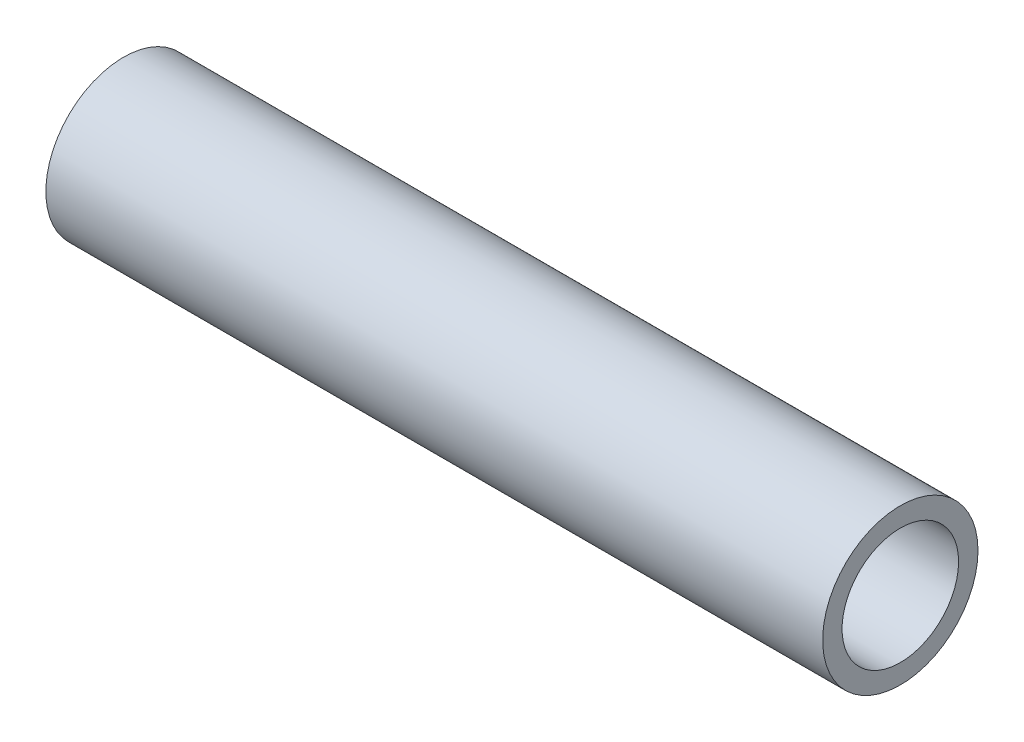
ISO-10303-21;
HEADER;
FILE_DESCRIPTION(('STEP AP214'),'2;1');
FILE_NAME('part.step','',(''),(''),'','','');
FILE_SCHEMA(('AUTOMOTIVE_DESIGN { 1 0 10303 214 1 1 1 1 }'));
ENDSEC;
DATA;
#1=APPLICATION_CONTEXT('core data for automotive mechanical design processes');
#2=APPLICATION_PROTOCOL_DEFINITION('international standard','automotive_design',2000,#1);
#3=PRODUCT_CONTEXT('',#1,'mechanical');
#4=PRODUCT('Part','Part','',(#3));
#5=PRODUCT_RELATED_PRODUCT_CATEGORY('part','',(#4));
#6=PRODUCT_DEFINITION_FORMATION('','',#4);
#7=PRODUCT_DEFINITION_CONTEXT('part definition',#1,'design');
#8=PRODUCT_DEFINITION('design','',#6,#7);
#9=PRODUCT_DEFINITION_SHAPE('','',#8);
#10=(LENGTH_UNIT() NAMED_UNIT(*) SI_UNIT(.MILLI.,.METRE.));
#11=(NAMED_UNIT(*) PLANE_ANGLE_UNIT() SI_UNIT($,.RADIAN.));
#12=(NAMED_UNIT(*) SI_UNIT($,.STERADIAN.) SOLID_ANGLE_UNIT());
#13=UNCERTAINTY_MEASURE_WITH_UNIT(LENGTH_MEASURE(1.E-05),#10,'distance_accuracy_value','');
#14=(GEOMETRIC_REPRESENTATION_CONTEXT(3) GLOBAL_UNCERTAINTY_ASSIGNED_CONTEXT((#13)) GLOBAL_UNIT_ASSIGNED_CONTEXT((#10,
#11,#12)) REPRESENTATION_CONTEXT('',''));
#15=CARTESIAN_POINT('',(0.,0.,0.));
#16=DIRECTION('',(0.,0.,1.));
#17=DIRECTION('',(1.,0.,0.));
#18=AXIS2_PLACEMENT_3D('',#15,#16,#17);
#19=CARTESIAN_POINT('',(0.,0.,0.));
#20=DIRECTION('',(1.,0.,0.));
#21=DIRECTION('',(0.,0.,-1.));
#22=AXIS2_PLACEMENT_3D('',#19,#20,#21);
#23=CYLINDRICAL_SURFACE('',#22,9.525);
#24=CARTESIAN_POINT('',(127.,0.,0.));
#25=DIRECTION('',(1.,0.,0.));
#26=DIRECTION('',(0.,0.,-1.));
#27=AXIS2_PLACEMENT_3D('',#24,#25,#26);
#28=CIRCLE('',#27,9.525);
#29=CARTESIAN_POINT('',(127.,0.,-9.525));
#30=VERTEX_POINT('',#29);
#31=EDGE_CURVE('E26',#30,#30,#28,.F.);
#32=ORIENTED_EDGE('',*,*,#31,.F.);
#33=EDGE_LOOP('',(#32));
#34=FACE_BOUND('',#33,.T.);
#35=CARTESIAN_POINT('',(0.,0.,0.));
#36=DIRECTION('',(1.,0.,0.));
#37=DIRECTION('',(0.,0.,-1.));
#38=AXIS2_PLACEMENT_3D('',#35,#36,#37);
#39=CIRCLE('',#38,9.525);
#40=CARTESIAN_POINT('',(0.,0.,-9.525));
#41=VERTEX_POINT('',#40);
#42=EDGE_CURVE('E17',#41,#41,#39,.F.);
#43=ORIENTED_EDGE('',*,*,#42,.T.);
#44=EDGE_LOOP('',(#43));
#45=FACE_BOUND('',#44,.T.);
#46=ADVANCED_FACE('F14',(#34,#45),#23,.F.);
#47=CARTESIAN_POINT('',(0.,0.,0.));
#48=DIRECTION('',(1.,0.,0.));
#49=DIRECTION('',(0.,0.,-1.));
#50=AXIS2_PLACEMENT_3D('',#47,#48,#49);
#51=PLANE('',#50);
#52=ORIENTED_EDGE('',*,*,#42,.F.);
#53=EDGE_LOOP('',(#52));
#54=FACE_BOUND('',#53,.T.);
#55=CARTESIAN_POINT('',(0.,0.,0.));
#56=DIRECTION('',(1.,0.,0.));
#57=DIRECTION('',(0.,0.,-1.));
#58=AXIS2_PLACEMENT_3D('',#55,#56,#57);
#59=CIRCLE('',#58,12.7);
#60=CARTESIAN_POINT('',(0.,0.,-12.7));
#61=VERTEX_POINT('',#60);
#62=EDGE_CURVE('E21',#61,#61,#59,.T.);
#63=ORIENTED_EDGE('',*,*,#62,.F.);
#64=EDGE_LOOP('',(#63));
#65=FACE_BOUND('',#64,.T.);
#66=ADVANCED_FACE('F35',(#54,#65),#51,.F.);
#67=CARTESIAN_POINT('',(127.,0.,0.));
#68=DIRECTION('',(1.,0.,0.));
#69=DIRECTION('',(0.,0.,-1.));
#70=AXIS2_PLACEMENT_3D('',#67,#68,#69);
#71=PLANE('',#70);
#72=ORIENTED_EDGE('',*,*,#31,.T.);
#73=EDGE_LOOP('',(#72));
#74=FACE_BOUND('',#73,.T.);
#75=CARTESIAN_POINT('',(127.,0.,0.));
#76=DIRECTION('',(1.,0.,0.));
#77=DIRECTION('',(0.,0.,-1.));
#78=AXIS2_PLACEMENT_3D('',#75,#76,#77);
#79=CIRCLE('',#78,12.7);
#80=CARTESIAN_POINT('',(127.,0.,-12.7));
#81=VERTEX_POINT('',#80);
#82=EDGE_CURVE('E10',#81,#81,#79,.F.);
#83=ORIENTED_EDGE('',*,*,#82,.F.);
#84=EDGE_LOOP('',(#83));
#85=FACE_BOUND('',#84,.T.);
#86=ADVANCED_FACE('F38',(#74,#85),#71,.T.);
#87=CARTESIAN_POINT('',(0.,0.,0.));
#88=DIRECTION('',(1.,0.,0.));
#89=DIRECTION('',(0.,0.,-1.));
#90=AXIS2_PLACEMENT_3D('',#87,#88,#89);
#91=CYLINDRICAL_SURFACE('',#90,12.7);
#92=ORIENTED_EDGE('',*,*,#82,.T.);
#93=EDGE_LOOP('',(#92));
#94=FACE_BOUND('',#93,.T.);
#95=ORIENTED_EDGE('',*,*,#62,.T.);
#96=EDGE_LOOP('',(#95));
#97=FACE_BOUND('',#96,.T.);
#98=ADVANCED_FACE('F41',(#94,#97),#91,.T.);
#99=CLOSED_SHELL('',(#46,#66,#86,#98));
#100=MANIFOLD_SOLID_BREP('B1',#99);
#101=ADVANCED_BREP_SHAPE_REPRESENTATION('',(#18,#100),#14);
#102=SHAPE_DEFINITION_REPRESENTATION(#9,#101);
ENDSEC;
END-ISO-10303-21;
